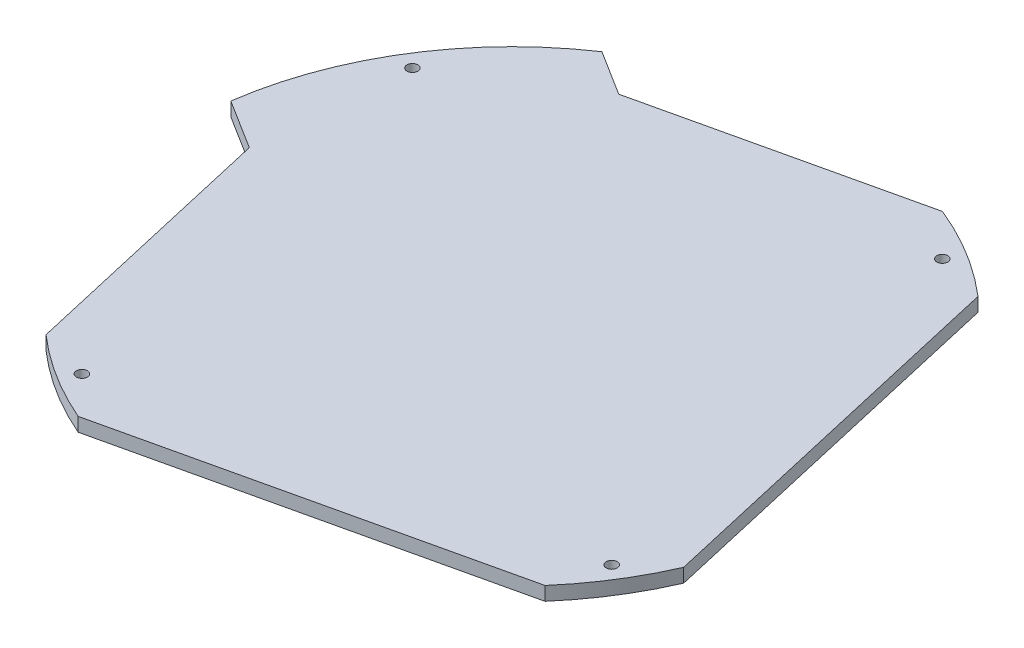
ISO-10303-21;
HEADER;
FILE_DESCRIPTION(('STEP AP214'),'2;1');
FILE_NAME('part.step','',(''),(''),'','','');
FILE_SCHEMA(('AUTOMOTIVE_DESIGN { 1 0 10303 214 1 1 1 1 }'));
ENDSEC;
DATA;
#1=APPLICATION_CONTEXT('core data for automotive mechanical design processes');
#2=APPLICATION_PROTOCOL_DEFINITION('international standard','automotive_design',2000,#1);
#3=PRODUCT_CONTEXT('',#1,'mechanical');
#4=PRODUCT('Part','Part','',(#3));
#5=PRODUCT_RELATED_PRODUCT_CATEGORY('part','',(#4));
#6=PRODUCT_DEFINITION_FORMATION('','',#4);
#7=PRODUCT_DEFINITION_CONTEXT('part definition',#1,'design');
#8=PRODUCT_DEFINITION('design','',#6,#7);
#9=PRODUCT_DEFINITION_SHAPE('','',#8);
#10=(LENGTH_UNIT() NAMED_UNIT(*) SI_UNIT(.MILLI.,.METRE.));
#11=(NAMED_UNIT(*) PLANE_ANGLE_UNIT() SI_UNIT($,.RADIAN.));
#12=(NAMED_UNIT(*) SI_UNIT($,.STERADIAN.) SOLID_ANGLE_UNIT());
#13=UNCERTAINTY_MEASURE_WITH_UNIT(LENGTH_MEASURE(1.E-05),#10,'distance_accuracy_value','');
#14=(GEOMETRIC_REPRESENTATION_CONTEXT(3) GLOBAL_UNCERTAINTY_ASSIGNED_CONTEXT((#13)) GLOBAL_UNIT_ASSIGNED_CONTEXT((#10,
#11,#12)) REPRESENTATION_CONTEXT('',''));
#15=CARTESIAN_POINT('',(0.,0.,0.));
#16=DIRECTION('',(0.,0.,1.));
#17=DIRECTION('',(1.,0.,0.));
#18=AXIS2_PLACEMENT_3D('',#15,#16,#17);
#19=CARTESIAN_POINT('',(509.954108379381,5.,605.93573442158));
#20=DIRECTION('',(0.,-1.,0.));
#21=DIRECTION('',(0.,0.,-1.));
#22=AXIS2_PLACEMENT_3D('',#19,#20,#21);
#23=CYLINDRICAL_SURFACE('',#22,120.000000000011);
#24=CARTESIAN_POINT('',(509.954108379381,0.,605.93573442158));
#25=DIRECTION('',(0.,1.,0.));
#26=DIRECTION('',(0.,0.,-1.));
#27=AXIS2_PLACEMENT_3D('',#24,#25,#26);
#28=CIRCLE('',#27,120.000000000011);
#29=CARTESIAN_POINT('',(442.992177211204,0.,506.356119167097));
#30=VERTEX_POINT('',#29);
#31=CARTESIAN_POINT('',(391.117156010245,0.,589.269038539719));
#32=VERTEX_POINT('',#31);
#33=EDGE_CURVE('E145',#30,#32,#28,.T.);
#34=ORIENTED_EDGE('',*,*,#33,.T.);
#35=DIRECTION('',(0.,-1.,0.));
#36=VECTOR('',#35,1.);
#37=CARTESIAN_POINT('',(391.117156010245,5.,589.269038539719));
#38=LINE('',#37,#36);
#39=CARTESIAN_POINT('',(391.117156010245,5.,589.269038539719));
#40=VERTEX_POINT('',#39);
#41=EDGE_CURVE('E11',#40,#32,#38,.T.);
#42=ORIENTED_EDGE('',*,*,#41,.F.);
#43=CARTESIAN_POINT('',(509.954108379381,5.,605.93573442158));
#44=DIRECTION('',(0.,1.,0.));
#45=DIRECTION('',(0.,0.,-1.));
#46=AXIS2_PLACEMENT_3D('',#43,#44,#45);
#47=CIRCLE('',#46,120.000000000011);
#48=CARTESIAN_POINT('',(442.992177211204,5.,506.356119167097));
#49=VERTEX_POINT('',#48);
#50=EDGE_CURVE('E164',#49,#40,#47,.T.);
#51=ORIENTED_EDGE('',*,*,#50,.F.);
#52=DIRECTION('',(0.,-1.,0.));
#53=VECTOR('',#52,1.);
#54=CARTESIAN_POINT('',(442.992177211204,5.,506.356119167097));
#55=LINE('',#54,#53);
#56=EDGE_CURVE('E141',#49,#30,#55,.T.);
#57=ORIENTED_EDGE('',*,*,#56,.T.);
#58=EDGE_LOOP('',(#34,#42,#51,#57));
#59=FACE_BOUND('',#58,.T.);
#60=ADVANCED_FACE('F37',(#59),#23,.T.);
#61=CARTESIAN_POINT('',(391.117156010245,5.,589.269038539719));
#62=DIRECTION('',(0.531429632055515,0.,-0.847102441369012));
#63=DIRECTION('',(-0.847102441369012,0.,-0.531429632055515));
#64=AXIS2_PLACEMENT_3D('',#61,#62,#63);
#65=PLANE('',#64);
#66=DIRECTION('',(0.847102441369012,0.,0.531429632055515));
#67=VECTOR('',#66,1.);
#68=CARTESIAN_POINT('',(391.117156010245,0.,589.269038539719));
#69=LINE('',#68,#67);
#70=CARTESIAN_POINT('',(409.134507605534,0.,600.572222264966));
#71=VERTEX_POINT('',#70);
#72=EDGE_CURVE('E148',#32,#71,#69,.T.);
#73=ORIENTED_EDGE('',*,*,#72,.T.);
#74=DIRECTION('',(0.,-1.,0.));
#75=VECTOR('',#74,1.);
#76=CARTESIAN_POINT('',(409.134507605534,5.,600.572222264966));
#77=LINE('',#76,#75);
#78=CARTESIAN_POINT('',(409.134507605534,5.,600.572222264966));
#79=VERTEX_POINT('',#78);
#80=EDGE_CURVE('E45',#79,#71,#77,.T.);
#81=ORIENTED_EDGE('',*,*,#80,.F.);
#82=DIRECTION('',(0.847102441369012,0.,0.531429632055515));
#83=VECTOR('',#82,1.);
#84=CARTESIAN_POINT('',(391.117156010245,5.,589.269038539719));
#85=LINE('',#84,#83);
#86=EDGE_CURVE('E102',#40,#79,#85,.T.);
#87=ORIENTED_EDGE('',*,*,#86,.F.);
#88=ORIENTED_EDGE('',*,*,#41,.T.);
#89=EDGE_LOOP('',(#73,#81,#87,#88));
#90=FACE_BOUND('',#89,.T.);
#91=ADVANCED_FACE('F264',(#90),#65,.F.);
#92=CARTESIAN_POINT('',(409.134507605534,5.,600.572222264966));
#93=DIRECTION('',(0.974769377201635,0.,-0.22321438410178));
#94=DIRECTION('',(-0.22321438410178,0.,-0.974769377201635));
#95=AXIS2_PLACEMENT_3D('',#92,#93,#94);
#96=PLANE('',#95);
#97=DIRECTION('',(0.22321438410178,0.,0.974769377201635));
#98=VECTOR('',#97,1.);
#99=CARTESIAN_POINT('',(409.134507605534,0.,600.572222264966));
#100=LINE('',#99,#98);
#101=CARTESIAN_POINT('',(431.070113815576,0.,696.364244315629));
#102=VERTEX_POINT('',#101);
#103=EDGE_CURVE('E151',#71,#102,#100,.T.);
#104=ORIENTED_EDGE('',*,*,#103,.T.);
#105=DIRECTION('',(0.,-1.,0.));
#106=VECTOR('',#105,1.);
#107=CARTESIAN_POINT('',(431.070113815576,5.,696.364244315629));
#108=LINE('',#107,#106);
#109=CARTESIAN_POINT('',(431.070113815576,5.,696.364244315629));
#110=VERTEX_POINT('',#109);
#111=EDGE_CURVE('E177',#110,#102,#108,.T.);
#112=ORIENTED_EDGE('',*,*,#111,.F.);
#113=DIRECTION('',(0.22321438410178,0.,0.974769377201635));
#114=VECTOR('',#113,1.);
#115=CARTESIAN_POINT('',(409.134507605534,5.,600.572222264966));
#116=LINE('',#115,#114);
#117=EDGE_CURVE('E185',#79,#110,#116,.T.);
#118=ORIENTED_EDGE('',*,*,#117,.F.);
#119=ORIENTED_EDGE('',*,*,#80,.T.);
#120=EDGE_LOOP('',(#104,#112,#118,#119));
#121=FACE_BOUND('',#120,.T.);
#122=ADVANCED_FACE('F183',(#121),#96,.F.);
#123=CARTESIAN_POINT('',(509.954108379442,5.,605.935734421459));
#124=DIRECTION('',(0.,-1.,0.));
#125=DIRECTION('',(0.,0.,-1.));
#126=AXIS2_PLACEMENT_3D('',#123,#124,#125);
#127=CYLINDRICAL_SURFACE('',#126,120.000000000134);
#128=CARTESIAN_POINT('',(509.954108379442,0.,605.935734421459));
#129=DIRECTION('',(0.,1.,0.));
#130=DIRECTION('',(0.,0.,1.));
#131=AXIS2_PLACEMENT_3D('',#128,#129,#130);
#132=CIRCLE('',#131,120.000000000134);
#133=CARTESIAN_POINT('',(462.598816983306,0.,716.196681165169));
#134=VERTEX_POINT('',#133);
#135=EDGE_CURVE('E153',#102,#134,#132,.T.);
#136=ORIENTED_EDGE('',*,*,#135,.T.);
#137=DIRECTION('',(0.,-1.,0.));
#138=VECTOR('',#137,1.);
#139=CARTESIAN_POINT('',(462.598816983306,5.,716.196681165169));
#140=LINE('',#139,#138);
#141=CARTESIAN_POINT('',(462.598816983306,5.,716.196681165169));
#142=VERTEX_POINT('',#141);
#143=EDGE_CURVE('E174',#142,#134,#140,.T.);
#144=ORIENTED_EDGE('',*,*,#143,.F.);
#145=CARTESIAN_POINT('',(509.954108379442,5.,605.935734421459));
#146=DIRECTION('',(0.,1.,0.));
#147=DIRECTION('',(0.,0.,1.));
#148=AXIS2_PLACEMENT_3D('',#145,#146,#147);
#149=CIRCLE('',#148,120.000000000134);
#150=EDGE_CURVE('E203',#110,#142,#149,.T.);
#151=ORIENTED_EDGE('',*,*,#150,.F.);
#152=ORIENTED_EDGE('',*,*,#111,.T.);
#153=EDGE_LOOP('',(#136,#144,#151,#152));
#154=FACE_BOUND('',#153,.T.);
#155=ADVANCED_FACE('F194',(#154),#127,.T.);
#156=CARTESIAN_POINT('',(462.598816983306,5.,716.196681165169));
#157=DIRECTION('',(-0.22321438410178,0.,-0.974769377201635));
#158=DIRECTION('',(-0.974769377201635,0.,0.22321438410178));
#159=AXIS2_PLACEMENT_3D('',#156,#157,#158);
#160=PLANE('',#159);
#161=DIRECTION('',(0.974769377201635,0.,-0.22321438410178));
#162=VECTOR('',#161,1.);
#163=CARTESIAN_POINT('',(462.598816983306,0.,716.196681165169));
#164=LINE('',#163,#162);
#165=CARTESIAN_POINT('',(600.572192141047,0.,684.601882766092));
#166=VERTEX_POINT('',#165);
#167=EDGE_CURVE('E155',#134,#166,#164,.T.);
#168=ORIENTED_EDGE('',*,*,#167,.T.);
#169=DIRECTION('',(0.,-1.,0.));
#170=VECTOR('',#169,1.);
#171=CARTESIAN_POINT('',(600.572192141047,5.,684.601882766092));
#172=LINE('',#171,#170);
#173=CARTESIAN_POINT('',(600.572192141047,5.,684.601882766092));
#174=VERTEX_POINT('',#173);
#175=EDGE_CURVE('E171',#174,#166,#172,.T.);
#176=ORIENTED_EDGE('',*,*,#175,.F.);
#177=DIRECTION('',(0.974769377201635,0.,-0.22321438410178));
#178=VECTOR('',#177,1.);
#179=CARTESIAN_POINT('',(462.598816983306,5.,716.196681165169));
#180=LINE('',#179,#178);
#181=EDGE_CURVE('E200',#142,#174,#180,.T.);
#182=ORIENTED_EDGE('',*,*,#181,.F.);
#183=ORIENTED_EDGE('',*,*,#143,.T.);
#184=EDGE_LOOP('',(#168,#176,#182,#183));
#185=FACE_BOUND('',#184,.T.);
#186=ADVANCED_FACE('F198',(#185),#160,.F.);
#187=CARTESIAN_POINT('',(509.954108378998,5.,605.93573442134));
#188=DIRECTION('',(0.,-1.,0.));
#189=DIRECTION('',(0.,0.,-1.));
#190=AXIS2_PLACEMENT_3D('',#187,#188,#189);
#191=CYLINDRICAL_SURFACE('',#190,120.000000000435);
#192=CARTESIAN_POINT('',(509.954108378998,0.,605.93573442134));
#193=DIRECTION('',(0.,1.,0.));
#194=DIRECTION('',(0.,0.,1.));
#195=AXIS2_PLACEMENT_3D('',#192,#193,#194);
#196=CIRCLE('',#195,120.000000000435);
#197=CARTESIAN_POINT('',(620.044894414012,0.,653.685277144775));
#198=VERTEX_POINT('',#197);
#199=EDGE_CURVE('E157',#166,#198,#196,.T.);
#200=ORIENTED_EDGE('',*,*,#199,.T.);
#201=DIRECTION('',(0.,-1.,0.));
#202=VECTOR('',#201,1.);
#203=CARTESIAN_POINT('',(620.044894414012,5.,653.685277144775));
#204=LINE('',#203,#202);
#205=CARTESIAN_POINT('',(620.044894414012,5.,653.685277144775));
#206=VERTEX_POINT('',#205);
#207=EDGE_CURVE('E168',#206,#198,#204,.T.);
#208=ORIENTED_EDGE('',*,*,#207,.F.);
#209=CARTESIAN_POINT('',(509.954108378998,5.,605.93573442134));
#210=DIRECTION('',(0.,1.,0.));
#211=DIRECTION('',(0.,0.,1.));
#212=AXIS2_PLACEMENT_3D('',#209,#210,#211);
#213=CIRCLE('',#212,120.000000000435);
#214=EDGE_CURVE('E202',#174,#206,#213,.T.);
#215=ORIENTED_EDGE('',*,*,#214,.F.);
#216=ORIENTED_EDGE('',*,*,#175,.T.);
#217=EDGE_LOOP('',(#200,#208,#215,#216));
#218=FACE_BOUND('',#217,.T.);
#219=ADVANCED_FACE('F276',(#218),#191,.T.);
#220=CARTESIAN_POINT('',(620.044894414012,5.,653.685277144775));
#221=DIRECTION('',(-0.974769377201635,0.,0.22321438410178));
#222=DIRECTION('',(0.22321438410178,0.,0.974769377201635));
#223=AXIS2_PLACEMENT_3D('',#220,#221,#222);
#224=PLANE('',#223);
#225=DIRECTION('',(-0.223214384101779,0.,-0.974769377201635));
#226=VECTOR('',#225,1.);
#227=CARTESIAN_POINT('',(620.044894414012,0.,653.685277144775));
#228=LINE('',#227,#226);
#229=CARTESIAN_POINT('',(588.295487999124,0.,515.036734211046));
#230=VERTEX_POINT('',#229);
#231=EDGE_CURVE('E159',#198,#230,#228,.T.);
#232=ORIENTED_EDGE('',*,*,#231,.T.);
#233=DIRECTION('',(0.,-1.,0.));
#234=VECTOR('',#233,1.);
#235=CARTESIAN_POINT('',(588.295487999124,5.,515.036734211046));
#236=LINE('',#235,#234);
#237=CARTESIAN_POINT('',(588.295487999124,5.,515.036734211046));
#238=VERTEX_POINT('',#237);
#239=EDGE_CURVE('E136',#238,#230,#236,.T.);
#240=ORIENTED_EDGE('',*,*,#239,.F.);
#241=DIRECTION('',(-0.223214384101779,0.,-0.974769377201635));
#242=VECTOR('',#241,1.);
#243=CARTESIAN_POINT('',(620.044894414012,5.,653.685277144775));
#244=LINE('',#243,#242);
#245=EDGE_CURVE('E127',#206,#238,#244,.T.);
#246=ORIENTED_EDGE('',*,*,#245,.F.);
#247=ORIENTED_EDGE('',*,*,#207,.T.);
#248=EDGE_LOOP('',(#232,#240,#246,#247));
#249=FACE_BOUND('',#248,.T.);
#250=ADVANCED_FACE('F273',(#249),#224,.F.);
#251=CARTESIAN_POINT('',(509.954108379225,5.,605.935734421811));
#252=DIRECTION('',(0.,-1.,0.));
#253=DIRECTION('',(0.,0.,-1.));
#254=AXIS2_PLACEMENT_3D('',#251,#252,#253);
#255=CYLINDRICAL_SURFACE('',#254,120.000000000275);
#256=CARTESIAN_POINT('',(509.954108379225,0.,605.935734421811));
#257=DIRECTION('',(0.,1.,0.));
#258=DIRECTION('',(0.,0.,1.));
#259=AXIS2_PLACEMENT_3D('',#256,#257,#258);
#260=CIRCLE('',#259,120.000000000275);
#261=CARTESIAN_POINT('',(555.102156345941,0.,494.752760163785));
#262=VERTEX_POINT('',#261);
#263=EDGE_CURVE('E135',#230,#262,#260,.T.);
#264=ORIENTED_EDGE('',*,*,#263,.T.);
#265=DIRECTION('',(0.,-1.,0.));
#266=VECTOR('',#265,1.);
#267=CARTESIAN_POINT('',(555.102156345941,5.,494.752760163785));
#268=LINE('',#267,#266);
#269=CARTESIAN_POINT('',(555.102156345941,5.,494.752760163785));
#270=VERTEX_POINT('',#269);
#271=EDGE_CURVE('E132',#270,#262,#268,.T.);
#272=ORIENTED_EDGE('',*,*,#271,.F.);
#273=CARTESIAN_POINT('',(509.954108379225,5.,605.935734421811));
#274=DIRECTION('',(0.,1.,0.));
#275=DIRECTION('',(0.,0.,1.));
#276=AXIS2_PLACEMENT_3D('',#273,#274,#275);
#277=CIRCLE('',#276,120.000000000275);
#278=EDGE_CURVE('E121',#238,#270,#277,.T.);
#279=ORIENTED_EDGE('',*,*,#278,.F.);
#280=ORIENTED_EDGE('',*,*,#239,.T.);
#281=EDGE_LOOP('',(#264,#272,#279,#280));
#282=FACE_BOUND('',#281,.T.);
#283=ADVANCED_FACE('F133',(#282),#255,.T.);
#284=CARTESIAN_POINT('',(555.102156345941,5.,494.752760163785));
#285=DIRECTION('',(0.22321438410178,0.,0.974769377201635));
#286=DIRECTION('',(0.974769377201635,0.,-0.22321438410178));
#287=AXIS2_PLACEMENT_3D('',#284,#285,#286);
#288=PLANE('',#287);
#289=DIRECTION('',(-0.974769377201635,0.,0.22321438410178));
#290=VECTOR('',#289,1.);
#291=CARTESIAN_POINT('',(555.102156345941,0.,494.752760163785));
#292=LINE('',#291,#290);
#293=CARTESIAN_POINT('',(459.421279690665,0.,516.66291496803));
#294=VERTEX_POINT('',#293);
#295=EDGE_CURVE('E88',#262,#294,#292,.T.);
#296=ORIENTED_EDGE('',*,*,#295,.T.);
#297=DIRECTION('',(0.,-1.,0.));
#298=VECTOR('',#297,1.);
#299=CARTESIAN_POINT('',(459.421279690665,5.,516.66291496803));
#300=LINE('',#299,#298);
#301=CARTESIAN_POINT('',(459.421279690665,5.,516.66291496803));
#302=VERTEX_POINT('',#301);
#303=EDGE_CURVE('E137',#302,#294,#300,.T.);
#304=ORIENTED_EDGE('',*,*,#303,.F.);
#305=DIRECTION('',(-0.974769377201635,0.,0.22321438410178));
#306=VECTOR('',#305,1.);
#307=CARTESIAN_POINT('',(555.102156345941,5.,494.752760163785));
#308=LINE('',#307,#306);
#309=EDGE_CURVE('E125',#270,#302,#308,.T.);
#310=ORIENTED_EDGE('',*,*,#309,.F.);
#311=ORIENTED_EDGE('',*,*,#271,.T.);
#312=EDGE_LOOP('',(#296,#304,#310,#311));
#313=FACE_BOUND('',#312,.T.);
#314=ADVANCED_FACE('F139',(#313),#288,.F.);
#315=CARTESIAN_POINT('',(459.421279690665,5.,516.66291496803));
#316=DIRECTION('',(-0.531429632055517,0.,0.847102441369011));
#317=DIRECTION('',(0.847102441369011,0.,0.531429632055517));
#318=AXIS2_PLACEMENT_3D('',#315,#316,#317);
#319=PLANE('',#318);
#320=DIRECTION('',(-0.847102441369011,0.,-0.531429632055517));
#321=VECTOR('',#320,1.);
#322=CARTESIAN_POINT('',(459.421279690665,0.,516.66291496803));
#323=LINE('',#322,#321);
#324=EDGE_CURVE('E94',#294,#30,#323,.T.);
#325=ORIENTED_EDGE('',*,*,#324,.T.);
#326=ORIENTED_EDGE('',*,*,#56,.F.);
#327=DIRECTION('',(-0.847102441369011,0.,-0.531429632055517));
#328=VECTOR('',#327,1.);
#329=CARTESIAN_POINT('',(459.421279690665,5.,516.66291496803));
#330=LINE('',#329,#328);
#331=EDGE_CURVE('E53',#302,#49,#330,.T.);
#332=ORIENTED_EDGE('',*,*,#331,.F.);
#333=ORIENTED_EDGE('',*,*,#303,.T.);
#334=EDGE_LOOP('',(#325,#326,#332,#333));
#335=FACE_BOUND('',#334,.T.);
#336=ADVANCED_FACE('F255',(#335),#319,.F.);
#337=CARTESIAN_POINT('',(509.954108379381,5.,605.93573442158));
#338=DIRECTION('',(0.,-1.,0.));
#339=DIRECTION('',(0.,0.,-1.));
#340=AXIS2_PLACEMENT_3D('',#337,#338,#339);
#341=PLANE('',#340);
#342=CARTESIAN_POINT('',(449.910379391197,5.,702.169476817666));
#343=DIRECTION('',(0.,-1.,0.));
#344=DIRECTION('',(0.,0.,-1.));
#345=AXIS2_PLACEMENT_3D('',#342,#343,#344);
#346=CIRCLE('',#345,1.99999999999989);
#347=CARTESIAN_POINT('',(449.910379391197,5.,700.169476817666));
#348=VERTEX_POINT('',#347);
#349=EDGE_CURVE('E149',#348,#348,#346,.T.);
#350=ORIENTED_EDGE('',*,*,#349,.T.);
#351=EDGE_LOOP('',(#350));
#352=FACE_BOUND('',#351,.T.);
#353=CARTESIAN_POINT('',(413.720365983245,5.,545.892005433443));
#354=DIRECTION('',(0.,-1.,0.));
#355=DIRECTION('',(0.,0.,-1.));
#356=AXIS2_PLACEMENT_3D('',#353,#354,#355);
#357=CIRCLE('',#356,2.00000000000005);
#358=CARTESIAN_POINT('',(413.720365983245,5.,543.892005433443));
#359=VERTEX_POINT('',#358);
#360=EDGE_CURVE('E213',#359,#359,#357,.T.);
#361=ORIENTED_EDGE('',*,*,#360,.T.);
#362=EDGE_LOOP('',(#361));
#363=FACE_BOUND('',#362,.T.);
#364=CARTESIAN_POINT('',(569.997837367462,5.,509.701992025393));
#365=DIRECTION('',(0.,-1.,0.));
#366=DIRECTION('',(0.,0.,-1.));
#367=AXIS2_PLACEMENT_3D('',#364,#365,#366);
#368=CIRCLE('',#367,1.99999999999989);
#369=CARTESIAN_POINT('',(569.997837367462,5.,507.701992025393));
#370=VERTEX_POINT('',#369);
#371=EDGE_CURVE('E216',#370,#370,#368,.T.);
#372=ORIENTED_EDGE('',*,*,#371,.T.);
#373=EDGE_LOOP('',(#372));
#374=FACE_BOUND('',#373,.T.);
#375=CARTESIAN_POINT('',(606.187850775496,5.,665.979463409704));
#376=DIRECTION('',(0.,-1.,0.));
#377=DIRECTION('',(0.,0.,-1.));
#378=AXIS2_PLACEMENT_3D('',#375,#376,#377);
#379=CIRCLE('',#378,1.99999999999989);
#380=CARTESIAN_POINT('',(606.187850775496,5.,663.979463409704));
#381=VERTEX_POINT('',#380);
#382=EDGE_CURVE('E219',#381,#381,#379,.T.);
#383=ORIENTED_EDGE('',*,*,#382,.T.);
#384=EDGE_LOOP('',(#383));
#385=FACE_BOUND('',#384,.T.);
#386=ORIENTED_EDGE('',*,*,#50,.T.);
#387=ORIENTED_EDGE('',*,*,#86,.T.);
#388=ORIENTED_EDGE('',*,*,#117,.T.);
#389=ORIENTED_EDGE('',*,*,#150,.T.);
#390=ORIENTED_EDGE('',*,*,#181,.T.);
#391=ORIENTED_EDGE('',*,*,#214,.T.);
#392=ORIENTED_EDGE('',*,*,#245,.T.);
#393=ORIENTED_EDGE('',*,*,#278,.T.);
#394=ORIENTED_EDGE('',*,*,#309,.T.);
#395=ORIENTED_EDGE('',*,*,#331,.T.);
#396=EDGE_LOOP('',(#386,#387,#388,#389,#390,#391,#392,#393,#394,#395));
#397=FACE_BOUND('',#396,.T.);
#398=ADVANCED_FACE('F123',(#352,#363,#374,#385,#397),#341,.F.);
#399=CARTESIAN_POINT('',(509.954108379381,0.,605.93573442158));
#400=DIRECTION('',(0.,-1.,0.));
#401=DIRECTION('',(0.,0.,-1.));
#402=AXIS2_PLACEMENT_3D('',#399,#400,#401);
#403=PLANE('',#402);
#404=CARTESIAN_POINT('',(449.910379391197,0.,702.169476817666));
#405=DIRECTION('',(0.,-1.,0.));
#406=DIRECTION('',(0.,0.,-1.));
#407=AXIS2_PLACEMENT_3D('',#404,#405,#406);
#408=CIRCLE('',#407,1.99999999999989);
#409=CARTESIAN_POINT('',(449.910379391197,0.,700.169476817666));
#410=VERTEX_POINT('',#409);
#411=EDGE_CURVE('E222',#410,#410,#408,.T.);
#412=ORIENTED_EDGE('',*,*,#411,.F.);
#413=EDGE_LOOP('',(#412));
#414=FACE_BOUND('',#413,.T.);
#415=CARTESIAN_POINT('',(413.720365983245,0.,545.892005433443));
#416=DIRECTION('',(0.,-1.,0.));
#417=DIRECTION('',(0.,0.,-1.));
#418=AXIS2_PLACEMENT_3D('',#415,#416,#417);
#419=CIRCLE('',#418,2.00000000000005);
#420=CARTESIAN_POINT('',(413.720365983245,0.,543.892005433443));
#421=VERTEX_POINT('',#420);
#422=EDGE_CURVE('E229',#421,#421,#419,.T.);
#423=ORIENTED_EDGE('',*,*,#422,.F.);
#424=EDGE_LOOP('',(#423));
#425=FACE_BOUND('',#424,.T.);
#426=CARTESIAN_POINT('',(569.997837367462,0.,509.701992025393));
#427=DIRECTION('',(0.,-1.,0.));
#428=DIRECTION('',(0.,0.,-1.));
#429=AXIS2_PLACEMENT_3D('',#426,#427,#428);
#430=CIRCLE('',#429,1.99999999999989);
#431=CARTESIAN_POINT('',(569.997837367462,0.,507.701992025393));
#432=VERTEX_POINT('',#431);
#433=EDGE_CURVE('E226',#432,#432,#430,.T.);
#434=ORIENTED_EDGE('',*,*,#433,.F.);
#435=EDGE_LOOP('',(#434));
#436=FACE_BOUND('',#435,.T.);
#437=CARTESIAN_POINT('',(606.187850775496,0.,665.979463409704));
#438=DIRECTION('',(0.,-1.,0.));
#439=DIRECTION('',(0.,0.,-1.));
#440=AXIS2_PLACEMENT_3D('',#437,#438,#439);
#441=CIRCLE('',#440,1.99999999999989);
#442=CARTESIAN_POINT('',(606.187850775496,0.,663.979463409704));
#443=VERTEX_POINT('',#442);
#444=EDGE_CURVE('E223',#443,#443,#441,.T.);
#445=ORIENTED_EDGE('',*,*,#444,.F.);
#446=EDGE_LOOP('',(#445));
#447=FACE_BOUND('',#446,.T.);
#448=ORIENTED_EDGE('',*,*,#33,.F.);
#449=ORIENTED_EDGE('',*,*,#324,.F.);
#450=ORIENTED_EDGE('',*,*,#295,.F.);
#451=ORIENTED_EDGE('',*,*,#263,.F.);
#452=ORIENTED_EDGE('',*,*,#231,.F.);
#453=ORIENTED_EDGE('',*,*,#199,.F.);
#454=ORIENTED_EDGE('',*,*,#167,.F.);
#455=ORIENTED_EDGE('',*,*,#135,.F.);
#456=ORIENTED_EDGE('',*,*,#103,.F.);
#457=ORIENTED_EDGE('',*,*,#72,.F.);
#458=EDGE_LOOP('',(#448,#449,#450,#451,#452,#453,#454,#455,#456,#457));
#459=FACE_BOUND('',#458,.T.);
#460=ADVANCED_FACE('F189',(#414,#425,#436,#447,#459),#403,.T.);
#461=CARTESIAN_POINT('',(606.187850775496,10.,665.979463409704));
#462=DIRECTION('',(0.,-1.,0.));
#463=DIRECTION('',(0.,0.,-1.));
#464=AXIS2_PLACEMENT_3D('',#461,#462,#463);
#465=CYLINDRICAL_SURFACE('',#464,1.99999999999989);
#466=ORIENTED_EDGE('',*,*,#444,.T.);
#467=EDGE_LOOP('',(#466));
#468=FACE_BOUND('',#467,.T.);
#469=ORIENTED_EDGE('',*,*,#382,.F.);
#470=EDGE_LOOP('',(#469));
#471=FACE_BOUND('',#470,.T.);
#472=ADVANCED_FACE('F240',(#468,#471),#465,.F.);
#473=CARTESIAN_POINT('',(569.997837367462,10.,509.701992025393));
#474=DIRECTION('',(0.,-1.,0.));
#475=DIRECTION('',(0.,0.,-1.));
#476=AXIS2_PLACEMENT_3D('',#473,#474,#475);
#477=CYLINDRICAL_SURFACE('',#476,1.99999999999989);
#478=ORIENTED_EDGE('',*,*,#433,.T.);
#479=EDGE_LOOP('',(#478));
#480=FACE_BOUND('',#479,.T.);
#481=ORIENTED_EDGE('',*,*,#371,.F.);
#482=EDGE_LOOP('',(#481));
#483=FACE_BOUND('',#482,.T.);
#484=ADVANCED_FACE('F250',(#480,#483),#477,.F.);
#485=CARTESIAN_POINT('',(413.720365983245,10.,545.892005433443));
#486=DIRECTION('',(0.,-1.,0.));
#487=DIRECTION('',(0.,0.,-1.));
#488=AXIS2_PLACEMENT_3D('',#485,#486,#487);
#489=CYLINDRICAL_SURFACE('',#488,2.00000000000005);
#490=ORIENTED_EDGE('',*,*,#422,.T.);
#491=EDGE_LOOP('',(#490));
#492=FACE_BOUND('',#491,.T.);
#493=ORIENTED_EDGE('',*,*,#360,.F.);
#494=EDGE_LOOP('',(#493));
#495=FACE_BOUND('',#494,.T.);
#496=ADVANCED_FACE('F367',(#492,#495),#489,.F.);
#497=CARTESIAN_POINT('',(449.910379391197,10.,702.169476817666));
#498=DIRECTION('',(0.,-1.,0.));
#499=DIRECTION('',(0.,0.,-1.));
#500=AXIS2_PLACEMENT_3D('',#497,#498,#499);
#501=CYLINDRICAL_SURFACE('',#500,1.99999999999989);
#502=ORIENTED_EDGE('',*,*,#411,.T.);
#503=EDGE_LOOP('',(#502));
#504=FACE_BOUND('',#503,.T.);
#505=ORIENTED_EDGE('',*,*,#349,.F.);
#506=EDGE_LOOP('',(#505));
#507=FACE_BOUND('',#506,.T.);
#508=ADVANCED_FACE('F235',(#504,#507),#501,.F.);
#509=CLOSED_SHELL('',(#60,#91,#122,#155,#186,#219,#250,#283,#314,#336,#398,#460,#472,#484,#496,#508));
#510=MANIFOLD_SOLID_BREP('B2',#509);
#511=ADVANCED_BREP_SHAPE_REPRESENTATION('',(#18,#510),#14);
#512=SHAPE_DEFINITION_REPRESENTATION(#9,#511);
ENDSEC;
END-ISO-10303-21;
